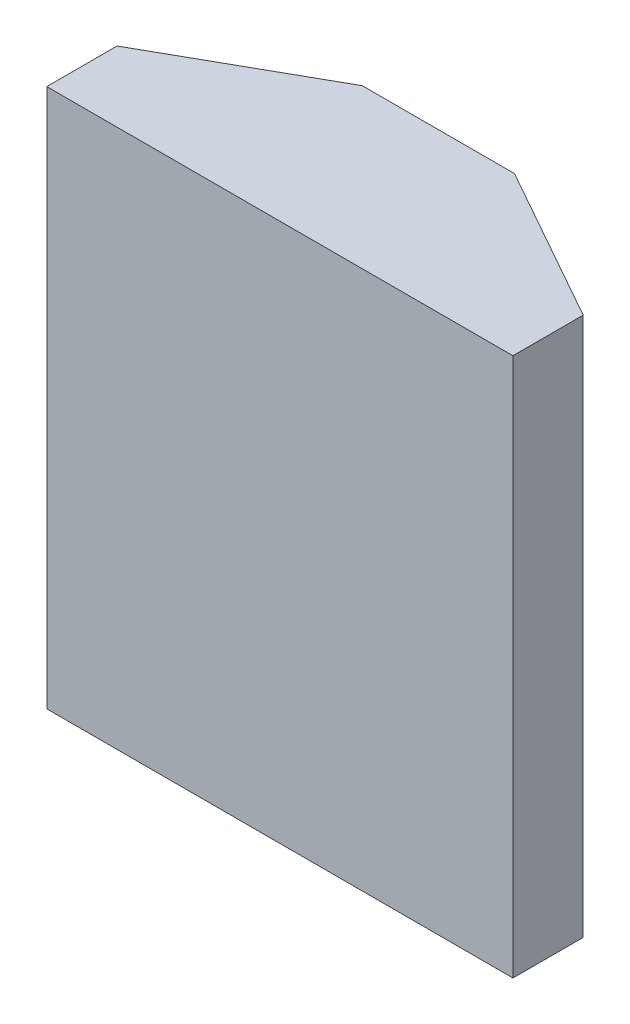
ISO-10303-21;
HEADER;
FILE_DESCRIPTION(('STEP AP214'),'2;1');
FILE_NAME('part.step','',(''),(''),'','','');
FILE_SCHEMA(('AUTOMOTIVE_DESIGN { 1 0 10303 214 1 1 1 1 }'));
ENDSEC;
DATA;
#1=APPLICATION_CONTEXT('core data for automotive mechanical design processes');
#2=APPLICATION_PROTOCOL_DEFINITION('international standard','automotive_design',2000,#1);
#3=PRODUCT_CONTEXT('',#1,'mechanical');
#4=PRODUCT('Part','Part','',(#3));
#5=PRODUCT_RELATED_PRODUCT_CATEGORY('part','',(#4));
#6=PRODUCT_DEFINITION_FORMATION('','',#4);
#7=PRODUCT_DEFINITION_CONTEXT('part definition',#1,'design');
#8=PRODUCT_DEFINITION('design','',#6,#7);
#9=PRODUCT_DEFINITION_SHAPE('','',#8);
#10=(LENGTH_UNIT() NAMED_UNIT(*) SI_UNIT(.MILLI.,.METRE.));
#11=(NAMED_UNIT(*) PLANE_ANGLE_UNIT() SI_UNIT($,.RADIAN.));
#12=(NAMED_UNIT(*) SI_UNIT($,.STERADIAN.) SOLID_ANGLE_UNIT());
#13=UNCERTAINTY_MEASURE_WITH_UNIT(LENGTH_MEASURE(1.E-05),#10,'distance_accuracy_value','');
#14=(GEOMETRIC_REPRESENTATION_CONTEXT(3) GLOBAL_UNCERTAINTY_ASSIGNED_CONTEXT((#13)) GLOBAL_UNIT_ASSIGNED_CONTEXT((#10,
#11,#12)) REPRESENTATION_CONTEXT('',''));
#15=CARTESIAN_POINT('',(0.,0.,0.));
#16=DIRECTION('',(0.,0.,1.));
#17=DIRECTION('',(1.,0.,0.));
#18=AXIS2_PLACEMENT_3D('',#15,#16,#17);
#19=CARTESIAN_POINT('',(18.895,1.,-1.00000000000001));
#20=DIRECTION('',(1.,0.,0.));
#21=DIRECTION('',(0.,0.,-1.));
#22=AXIS2_PLACEMENT_3D('',#19,#20,#21);
#23=PLANE('',#22);
#24=DIRECTION('',(0.,0.,-1.));
#25=VECTOR('',#24,1.);
#26=CARTESIAN_POINT('',(18.895,45.,-1.00000000000001));
#27=LINE('',#26,#25);
#28=CARTESIAN_POINT('',(18.895,45.,-1.00000000000001));
#29=VERTEX_POINT('',#28);
#30=CARTESIAN_POINT('',(18.895,45.,-5.4149740950109));
#31=VERTEX_POINT('',#30);
#32=EDGE_CURVE('E186',#29,#31,#27,.T.);
#33=ORIENTED_EDGE('',*,*,#32,.T.);
#34=DIRECTION('',(0.,1.,0.));
#35=VECTOR('',#34,1.);
#36=CARTESIAN_POINT('',(18.895,1.,-5.4149740950109));
#37=LINE('',#36,#35);
#38=CARTESIAN_POINT('',(18.895,1.,-5.4149740950109));
#39=VERTEX_POINT('',#38);
#40=EDGE_CURVE('E185',#39,#31,#37,.T.);
#41=ORIENTED_EDGE('',*,*,#40,.F.);
#42=DIRECTION('',(0.,0.,-1.));
#43=VECTOR('',#42,1.);
#44=CARTESIAN_POINT('',(18.895,1.,-1.00000000000001));
#45=LINE('',#44,#43);
#46=CARTESIAN_POINT('',(18.895,1.,-1.00000000000001));
#47=VERTEX_POINT('',#46);
#48=EDGE_CURVE('E204',#47,#39,#45,.T.);
#49=ORIENTED_EDGE('',*,*,#48,.F.);
#50=DIRECTION('',(0.,1.,0.));
#51=VECTOR('',#50,1.);
#52=CARTESIAN_POINT('',(18.895,1.,-1.00000000000001));
#53=LINE('',#52,#51);
#54=EDGE_CURVE('E205',#47,#29,#53,.T.);
#55=ORIENTED_EDGE('',*,*,#54,.T.);
#56=EDGE_LOOP('',(#33,#41,#49,#55));
#57=FACE_BOUND('',#56,.T.);
#58=ADVANCED_FACE('F36',(#57),#23,.F.);
#59=CARTESIAN_POINT('',(-18.895,1.,-1.));
#60=DIRECTION('',(0.,0.,1.));
#61=DIRECTION('',(1.,0.,0.));
#62=AXIS2_PLACEMENT_3D('',#59,#60,#61);
#63=PLANE('',#62);
#64=DIRECTION('',(1.,0.,0.));
#65=VECTOR('',#64,1.);
#66=CARTESIAN_POINT('',(-18.895,45.,-1.));
#67=LINE('',#66,#65);
#68=CARTESIAN_POINT('',(-18.895,45.,-1.));
#69=VERTEX_POINT('',#68);
#70=EDGE_CURVE('E201',#69,#29,#67,.T.);
#71=ORIENTED_EDGE('',*,*,#70,.T.);
#72=ORIENTED_EDGE('',*,*,#54,.F.);
#73=DIRECTION('',(1.,0.,0.));
#74=VECTOR('',#73,1.);
#75=CARTESIAN_POINT('',(-18.895,1.,-1.));
#76=LINE('',#75,#74);
#77=CARTESIAN_POINT('',(-18.895,1.,-1.));
#78=VERTEX_POINT('',#77);
#79=EDGE_CURVE('E182',#78,#47,#76,.T.);
#80=ORIENTED_EDGE('',*,*,#79,.F.);
#81=DIRECTION('',(0.,1.,0.));
#82=VECTOR('',#81,1.);
#83=CARTESIAN_POINT('',(-18.895,1.,-1.));
#84=LINE('',#83,#82);
#85=EDGE_CURVE('E208',#78,#69,#84,.T.);
#86=ORIENTED_EDGE('',*,*,#85,.T.);
#87=EDGE_LOOP('',(#71,#72,#80,#86));
#88=FACE_BOUND('',#87,.T.);
#89=ADVANCED_FACE('F295',(#88),#63,.F.);
#90=CARTESIAN_POINT('',(-18.895,1.,-5.41497409501089));
#91=DIRECTION('',(-1.,0.,0.));
#92=DIRECTION('',(0.,0.,1.));
#93=AXIS2_PLACEMENT_3D('',#90,#91,#92);
#94=PLANE('',#93);
#95=DIRECTION('',(0.,0.,1.));
#96=VECTOR('',#95,1.);
#97=CARTESIAN_POINT('',(-18.895,45.,-5.41497409501089));
#98=LINE('',#97,#96);
#99=CARTESIAN_POINT('',(-18.895,45.,-5.41497409501089));
#100=VERTEX_POINT('',#99);
#101=EDGE_CURVE('E198',#100,#69,#98,.T.);
#102=ORIENTED_EDGE('',*,*,#101,.T.);
#103=ORIENTED_EDGE('',*,*,#85,.F.);
#104=DIRECTION('',(0.,0.,1.));
#105=VECTOR('',#104,1.);
#106=CARTESIAN_POINT('',(-18.895,1.,-5.41497409501089));
#107=LINE('',#106,#105);
#108=CARTESIAN_POINT('',(-18.895,1.,-5.41497409501089));
#109=VERTEX_POINT('',#108);
#110=EDGE_CURVE('E175',#109,#78,#107,.T.);
#111=ORIENTED_EDGE('',*,*,#110,.F.);
#112=DIRECTION('',(0.,1.,0.));
#113=VECTOR('',#112,1.);
#114=CARTESIAN_POINT('',(-18.895,1.,-5.41497409501089));
#115=LINE('',#114,#113);
#116=EDGE_CURVE('E210',#109,#100,#115,.T.);
#117=ORIENTED_EDGE('',*,*,#116,.T.);
#118=EDGE_LOOP('',(#102,#103,#111,#117));
#119=FACE_BOUND('',#118,.T.);
#120=ADVANCED_FACE('F301',(#119),#94,.F.);
#121=CARTESIAN_POINT('',(-6.23819096981021,1.,-12.53));
#122=DIRECTION('',(-0.490029494264105,0.,-0.871705853342322));
#123=DIRECTION('',(-0.871705853342322,0.,0.490029494264105));
#124=AXIS2_PLACEMENT_3D('',#121,#122,#123);
#125=PLANE('',#124);
#126=DIRECTION('',(-0.871705853342322,0.,0.490029494264105));
#127=VECTOR('',#126,1.);
#128=CARTESIAN_POINT('',(-6.23819096981021,45.,-12.53));
#129=LINE('',#128,#127);
#130=CARTESIAN_POINT('',(-6.23819096981021,45.,-12.53));
#131=VERTEX_POINT('',#130);
#132=EDGE_CURVE('E195',#131,#100,#129,.T.);
#133=ORIENTED_EDGE('',*,*,#132,.T.);
#134=ORIENTED_EDGE('',*,*,#116,.F.);
#135=DIRECTION('',(-0.871705853342322,0.,0.490029494264105));
#136=VECTOR('',#135,1.);
#137=CARTESIAN_POINT('',(-6.23819096981021,1.,-12.53));
#138=LINE('',#137,#136);
#139=CARTESIAN_POINT('',(-6.23819096981021,1.,-12.53));
#140=VERTEX_POINT('',#139);
#141=EDGE_CURVE('E171',#140,#109,#138,.T.);
#142=ORIENTED_EDGE('',*,*,#141,.F.);
#143=DIRECTION('',(0.,1.,0.));
#144=VECTOR('',#143,1.);
#145=CARTESIAN_POINT('',(-6.23819096981021,1.,-12.53));
#146=LINE('',#145,#144);
#147=EDGE_CURVE('E212',#140,#131,#146,.T.);
#148=ORIENTED_EDGE('',*,*,#147,.T.);
#149=EDGE_LOOP('',(#133,#134,#142,#148));
#150=FACE_BOUND('',#149,.T.);
#151=ADVANCED_FACE('F339',(#150),#125,.F.);
#152=CARTESIAN_POINT('',(6.23819096981021,1.,-12.53));
#153=DIRECTION('',(0.,0.,-1.));
#154=DIRECTION('',(-1.,0.,0.));
#155=AXIS2_PLACEMENT_3D('',#152,#153,#154);
#156=PLANE('',#155);
#157=DIRECTION('',(-1.,0.,0.));
#158=VECTOR('',#157,1.);
#159=CARTESIAN_POINT('',(6.23819096981021,45.,-12.53));
#160=LINE('',#159,#158);
#161=CARTESIAN_POINT('',(6.23819096981021,45.,-12.53));
#162=VERTEX_POINT('',#161);
#163=EDGE_CURVE('E193',#162,#131,#160,.T.);
#164=ORIENTED_EDGE('',*,*,#163,.T.);
#165=ORIENTED_EDGE('',*,*,#147,.F.);
#166=DIRECTION('',(-1.,0.,0.));
#167=VECTOR('',#166,1.);
#168=CARTESIAN_POINT('',(6.23819096981021,1.,-12.53));
#169=LINE('',#168,#167);
#170=CARTESIAN_POINT('',(-2.89,1.,-12.53));
#171=VERTEX_POINT('',#170);
#172=EDGE_CURVE('E172',#171,#140,#169,.T.);
#173=ORIENTED_EDGE('',*,*,#172,.F.);
#174=DIRECTION('',(0.,-1.,0.));
#175=VECTOR('',#174,1.);
#176=CARTESIAN_POINT('',(-2.89,46.001,-12.53));
#177=LINE('',#176,#175);
#178=CARTESIAN_POINT('',(-2.89,0.,-12.53));
#179=VERTEX_POINT('',#178);
#180=EDGE_CURVE('E321',#171,#179,#177,.T.);
#181=ORIENTED_EDGE('',*,*,#180,.T.);
#182=DIRECTION('',(1.,0.,0.));
#183=VECTOR('',#182,1.);
#184=CARTESIAN_POINT('',(-2.89,0.,-12.53));
#185=LINE('',#184,#183);
#186=CARTESIAN_POINT('',(2.89,0.,-12.53));
#187=VERTEX_POINT('',#186);
#188=EDGE_CURVE('E164',#179,#187,#185,.T.);
#189=ORIENTED_EDGE('',*,*,#188,.T.);
#190=DIRECTION('',(0.,-1.,0.));
#191=VECTOR('',#190,1.);
#192=CARTESIAN_POINT('',(2.89,46.001,-12.53));
#193=LINE('',#192,#191);
#194=CARTESIAN_POINT('',(2.89,1.,-12.53));
#195=VERTEX_POINT('',#194);
#196=EDGE_CURVE('E150',#195,#187,#193,.T.);
#197=ORIENTED_EDGE('',*,*,#196,.F.);
#198=CARTESIAN_POINT('',(6.23819096981021,1.,-12.53));
#199=VERTEX_POINT('',#198);
#200=EDGE_CURVE('E161',#199,#195,#169,.T.);
#201=ORIENTED_EDGE('',*,*,#200,.F.);
#202=DIRECTION('',(0.,1.,0.));
#203=VECTOR('',#202,1.);
#204=CARTESIAN_POINT('',(6.23819096981021,1.,-12.53));
#205=LINE('',#204,#203);
#206=EDGE_CURVE('E214',#199,#162,#205,.T.);
#207=ORIENTED_EDGE('',*,*,#206,.T.);
#208=EDGE_LOOP('',(#164,#165,#173,#181,#189,#197,#201,#207));
#209=FACE_BOUND('',#208,.T.);
#210=ADVANCED_FACE('F160',(#209),#156,.F.);
#211=CARTESIAN_POINT('',(18.895,1.,-5.4149740950109));
#212=DIRECTION('',(0.490029494264104,0.,-0.871705853342322));
#213=DIRECTION('',(-0.871705853342322,0.,-0.490029494264104));
#214=AXIS2_PLACEMENT_3D('',#211,#212,#213);
#215=PLANE('',#214);
#216=DIRECTION('',(-0.871705853342323,0.,-0.490029494264104));
#217=VECTOR('',#216,1.);
#218=CARTESIAN_POINT('',(18.895,45.,-5.4149740950109));
#219=LINE('',#218,#217);
#220=EDGE_CURVE('E189',#31,#162,#219,.T.);
#221=ORIENTED_EDGE('',*,*,#220,.T.);
#222=ORIENTED_EDGE('',*,*,#206,.F.);
#223=DIRECTION('',(-0.871705853342323,0.,-0.490029494264104));
#224=VECTOR('',#223,1.);
#225=CARTESIAN_POINT('',(18.895,1.,-5.4149740950109));
#226=LINE('',#225,#224);
#227=EDGE_CURVE('E170',#39,#199,#226,.T.);
#228=ORIENTED_EDGE('',*,*,#227,.F.);
#229=ORIENTED_EDGE('',*,*,#40,.T.);
#230=EDGE_LOOP('',(#221,#222,#228,#229));
#231=FACE_BOUND('',#230,.T.);
#232=ADVANCED_FACE('F305',(#231),#215,.F.);
#233=CARTESIAN_POINT('',(0.,1.,0.));
#234=DIRECTION('',(0.,1.,0.));
#235=DIRECTION('',(0.,0.,1.));
#236=AXIS2_PLACEMENT_3D('',#233,#234,#235);
#237=PLANE('',#236);
#238=DIRECTION('',(-1.,0.,0.));
#239=VECTOR('',#238,1.);
#240=CARTESIAN_POINT('',(-2.89,1.,-9.97));
#241=LINE('',#240,#239);
#242=CARTESIAN_POINT('',(2.89,1.,-9.97));
#243=VERTEX_POINT('',#242);
#244=CARTESIAN_POINT('',(-2.89,1.,-9.97));
#245=VERTEX_POINT('',#244);
#246=EDGE_CURVE('E322',#243,#245,#241,.T.);
#247=ORIENTED_EDGE('',*,*,#246,.T.);
#248=CARTESIAN_POINT('',(-2.89,1.,-11.25));
#249=DIRECTION('',(0.,1.,0.));
#250=DIRECTION('',(0.,0.,1.));
#251=AXIS2_PLACEMENT_3D('',#248,#249,#250);
#252=CIRCLE('',#251,1.28);
#253=EDGE_CURVE('E318',#245,#171,#252,.F.);
#254=ORIENTED_EDGE('',*,*,#253,.T.);
#255=ORIENTED_EDGE('',*,*,#172,.T.);
#256=ORIENTED_EDGE('',*,*,#141,.T.);
#257=ORIENTED_EDGE('',*,*,#110,.T.);
#258=ORIENTED_EDGE('',*,*,#79,.T.);
#259=ORIENTED_EDGE('',*,*,#48,.T.);
#260=ORIENTED_EDGE('',*,*,#227,.T.);
#261=ORIENTED_EDGE('',*,*,#200,.T.);
#262=CARTESIAN_POINT('',(2.89,1.,-11.25));
#263=DIRECTION('',(0.,1.,0.));
#264=DIRECTION('',(0.,0.,1.));
#265=AXIS2_PLACEMENT_3D('',#262,#263,#264);
#266=CIRCLE('',#265,1.28);
#267=EDGE_CURVE('E147',#195,#243,#266,.F.);
#268=ORIENTED_EDGE('',*,*,#267,.T.);
#269=EDGE_LOOP('',(#247,#254,#255,#256,#257,#258,#259,#260,#261,#268));
#270=FACE_BOUND('',#269,.T.);
#271=ADVANCED_FACE('F167',(#270),#237,.T.);
#272=CARTESIAN_POINT('',(0.,45.,0.));
#273=DIRECTION('',(0.,1.,0.));
#274=DIRECTION('',(0.,0.,1.));
#275=AXIS2_PLACEMENT_3D('',#272,#273,#274);
#276=PLANE('',#275);
#277=ORIENTED_EDGE('',*,*,#32,.F.);
#278=ORIENTED_EDGE('',*,*,#70,.F.);
#279=ORIENTED_EDGE('',*,*,#101,.F.);
#280=ORIENTED_EDGE('',*,*,#132,.F.);
#281=ORIENTED_EDGE('',*,*,#163,.F.);
#282=ORIENTED_EDGE('',*,*,#220,.F.);
#283=EDGE_LOOP('',(#277,#278,#279,#280,#281,#282));
#284=FACE_BOUND('',#283,.T.);
#285=ADVANCED_FACE('F335',(#284),#276,.F.);
#286=CARTESIAN_POINT('',(-2.89,46.001,-11.25));
#287=DIRECTION('',(0.,-1.,0.));
#288=DIRECTION('',(0.,0.,-1.));
#289=AXIS2_PLACEMENT_3D('',#286,#287,#288);
#290=CYLINDRICAL_SURFACE('',#289,1.28);
#291=DIRECTION('',(0.,-1.,0.));
#292=VECTOR('',#291,1.);
#293=CARTESIAN_POINT('',(-2.89,46.001,-9.97));
#294=LINE('',#293,#292);
#295=CARTESIAN_POINT('',(-2.89,0.,-9.97));
#296=VERTEX_POINT('',#295);
#297=EDGE_CURVE('E155',#245,#296,#294,.T.);
#298=ORIENTED_EDGE('',*,*,#297,.T.);
#299=CARTESIAN_POINT('',(-2.89,0.,-11.25));
#300=DIRECTION('',(0.,-1.,0.));
#301=DIRECTION('',(0.,0.,-1.));
#302=AXIS2_PLACEMENT_3D('',#299,#300,#301);
#303=CIRCLE('',#302,1.28);
#304=EDGE_CURVE('E59',#296,#179,#303,.T.);
#305=ORIENTED_EDGE('',*,*,#304,.T.);
#306=ORIENTED_EDGE('',*,*,#180,.F.);
#307=ORIENTED_EDGE('',*,*,#253,.F.);
#308=EDGE_LOOP('',(#298,#305,#306,#307));
#309=FACE_BOUND('',#308,.T.);
#310=ADVANCED_FACE('F344',(#309),#290,.F.);
#311=CARTESIAN_POINT('',(-2.89,46.001,-9.97));
#312=DIRECTION('',(0.,0.,1.));
#313=DIRECTION('',(1.,0.,0.));
#314=AXIS2_PLACEMENT_3D('',#311,#312,#313);
#315=PLANE('',#314);
#316=DIRECTION('',(0.,-1.,0.));
#317=VECTOR('',#316,1.);
#318=CARTESIAN_POINT('',(2.89,46.001,-9.97));
#319=LINE('',#318,#317);
#320=CARTESIAN_POINT('',(2.89,0.,-9.97));
#321=VERTEX_POINT('',#320);
#322=EDGE_CURVE('E51',#243,#321,#319,.T.);
#323=ORIENTED_EDGE('',*,*,#322,.T.);
#324=DIRECTION('',(-1.,0.,0.));
#325=VECTOR('',#324,1.);
#326=CARTESIAN_POINT('',(-2.89,0.,-9.97));
#327=LINE('',#326,#325);
#328=EDGE_CURVE('E190',#321,#296,#327,.T.);
#329=ORIENTED_EDGE('',*,*,#328,.T.);
#330=ORIENTED_EDGE('',*,*,#297,.F.);
#331=ORIENTED_EDGE('',*,*,#246,.F.);
#332=EDGE_LOOP('',(#323,#329,#330,#331));
#333=FACE_BOUND('',#332,.T.);
#334=ADVANCED_FACE('F347',(#333),#315,.F.);
#335=CARTESIAN_POINT('',(2.89,46.001,-11.25));
#336=DIRECTION('',(0.,-1.,0.));
#337=DIRECTION('',(0.,0.,-1.));
#338=AXIS2_PLACEMENT_3D('',#335,#336,#337);
#339=CYLINDRICAL_SURFACE('',#338,1.28);
#340=ORIENTED_EDGE('',*,*,#196,.T.);
#341=CARTESIAN_POINT('',(2.89,0.,-11.25));
#342=DIRECTION('',(0.,-1.,0.));
#343=DIRECTION('',(0.,0.,-1.));
#344=AXIS2_PLACEMENT_3D('',#341,#342,#343);
#345=CIRCLE('',#344,1.28);
#346=EDGE_CURVE('E312',#187,#321,#345,.T.);
#347=ORIENTED_EDGE('',*,*,#346,.T.);
#348=ORIENTED_EDGE('',*,*,#322,.F.);
#349=ORIENTED_EDGE('',*,*,#267,.F.);
#350=EDGE_LOOP('',(#340,#347,#348,#349));
#351=FACE_BOUND('',#350,.T.);
#352=ADVANCED_FACE('F149',(#351),#339,.F.);
#353=CARTESIAN_POINT('',(19.895,46.,0.));
#354=DIRECTION('',(-1.,0.,0.));
#355=DIRECTION('',(0.,0.,1.));
#356=AXIS2_PLACEMENT_3D('',#353,#354,#355);
#357=PLANE('',#356);
#358=DIRECTION('',(0.,0.,-1.));
#359=VECTOR('',#358,1.);
#360=CARTESIAN_POINT('',(19.895,0.,0.));
#361=LINE('',#360,#359);
#362=CARTESIAN_POINT('',(19.895,0.,0.));
#363=VERTEX_POINT('',#362);
#364=CARTESIAN_POINT('',(19.895,0.,-6.00000000000001));
#365=VERTEX_POINT('',#364);
#366=EDGE_CURVE('E207',#363,#365,#361,.T.);
#367=ORIENTED_EDGE('',*,*,#366,.T.);
#368=DIRECTION('',(0.,-1.,0.));
#369=VECTOR('',#368,1.);
#370=CARTESIAN_POINT('',(19.895,46.,-6.00000000000001));
#371=LINE('',#370,#369);
#372=CARTESIAN_POINT('',(19.895,46.,-6.00000000000001));
#373=VERTEX_POINT('',#372);
#374=EDGE_CURVE('E11',#373,#365,#371,.T.);
#375=ORIENTED_EDGE('',*,*,#374,.F.);
#376=DIRECTION('',(0.,0.,-1.));
#377=VECTOR('',#376,1.);
#378=CARTESIAN_POINT('',(19.895,46.,0.));
#379=LINE('',#378,#377);
#380=CARTESIAN_POINT('',(19.895,46.,0.));
#381=VERTEX_POINT('',#380);
#382=EDGE_CURVE('E217',#381,#373,#379,.T.);
#383=ORIENTED_EDGE('',*,*,#382,.F.);
#384=DIRECTION('',(0.,-1.,0.));
#385=VECTOR('',#384,1.);
#386=CARTESIAN_POINT('',(19.895,46.,0.));
#387=LINE('',#386,#385);
#388=EDGE_CURVE('E231',#381,#363,#387,.T.);
#389=ORIENTED_EDGE('',*,*,#388,.T.);
#390=EDGE_LOOP('',(#367,#375,#383,#389));
#391=FACE_BOUND('',#390,.T.);
#392=ADVANCED_FACE('F38',(#391),#357,.F.);
#393=CARTESIAN_POINT('',(19.895,46.,-6.00000000000001));
#394=DIRECTION('',(-0.490029494264104,0.,0.871705853342322));
#395=DIRECTION('',(0.871705853342322,0.,0.490029494264104));
#396=AXIS2_PLACEMENT_3D('',#393,#394,#395);
#397=PLANE('',#396);
#398=DIRECTION('',(-0.871705853342322,0.,-0.490029494264104));
#399=VECTOR('',#398,1.);
#400=CARTESIAN_POINT('',(19.895,0.,-6.00000000000001));
#401=LINE('',#400,#399);
#402=CARTESIAN_POINT('',(6.5,0.,-13.53));
#403=VERTEX_POINT('',#402);
#404=EDGE_CURVE('E234',#365,#403,#401,.T.);
#405=ORIENTED_EDGE('',*,*,#404,.T.);
#406=DIRECTION('',(0.,-1.,0.));
#407=VECTOR('',#406,1.);
#408=CARTESIAN_POINT('',(6.5,46.,-13.53));
#409=LINE('',#408,#407);
#410=CARTESIAN_POINT('',(6.5,46.,-13.53));
#411=VERTEX_POINT('',#410);
#412=EDGE_CURVE('E44',#411,#403,#409,.T.);
#413=ORIENTED_EDGE('',*,*,#412,.F.);
#414=DIRECTION('',(-0.871705853342322,0.,-0.490029494264104));
#415=VECTOR('',#414,1.);
#416=CARTESIAN_POINT('',(19.895,46.,-6.00000000000001));
#417=LINE('',#416,#415);
#418=EDGE_CURVE('E220',#373,#411,#417,.T.);
#419=ORIENTED_EDGE('',*,*,#418,.F.);
#420=ORIENTED_EDGE('',*,*,#374,.T.);
#421=EDGE_LOOP('',(#405,#413,#419,#420));
#422=FACE_BOUND('',#421,.T.);
#423=ADVANCED_FACE('F281',(#422),#397,.F.);
#424=CARTESIAN_POINT('',(6.5,46.,-13.53));
#425=DIRECTION('',(0.,0.,1.));
#426=DIRECTION('',(1.,0.,0.));
#427=AXIS2_PLACEMENT_3D('',#424,#425,#426);
#428=PLANE('',#427);
#429=DIRECTION('',(-1.,0.,0.));
#430=VECTOR('',#429,1.);
#431=CARTESIAN_POINT('',(6.5,0.,-13.53));
#432=LINE('',#431,#430);
#433=CARTESIAN_POINT('',(-6.5,0.,-13.53));
#434=VERTEX_POINT('',#433);
#435=EDGE_CURVE('E236',#403,#434,#432,.T.);
#436=ORIENTED_EDGE('',*,*,#435,.T.);
#437=DIRECTION('',(0.,-1.,0.));
#438=VECTOR('',#437,1.);
#439=CARTESIAN_POINT('',(-6.5,46.,-13.53));
#440=LINE('',#439,#438);
#441=CARTESIAN_POINT('',(-6.5,46.,-13.53));
#442=VERTEX_POINT('',#441);
#443=EDGE_CURVE('E251',#442,#434,#440,.T.);
#444=ORIENTED_EDGE('',*,*,#443,.F.);
#445=DIRECTION('',(-1.,0.,0.));
#446=VECTOR('',#445,1.);
#447=CARTESIAN_POINT('',(6.5,46.,-13.53));
#448=LINE('',#447,#446);
#449=EDGE_CURVE('E223',#411,#442,#448,.T.);
#450=ORIENTED_EDGE('',*,*,#449,.F.);
#451=ORIENTED_EDGE('',*,*,#412,.T.);
#452=EDGE_LOOP('',(#436,#444,#450,#451));
#453=FACE_BOUND('',#452,.T.);
#454=ADVANCED_FACE('F258',(#453),#428,.F.);
#455=CARTESIAN_POINT('',(-6.5,46.,-13.53));
#456=DIRECTION('',(0.490029494264105,0.,0.871705853342322));
#457=DIRECTION('',(0.871705853342322,0.,-0.490029494264105));
#458=AXIS2_PLACEMENT_3D('',#455,#456,#457);
#459=PLANE('',#458);
#460=DIRECTION('',(-0.871705853342322,0.,0.490029494264104));
#461=VECTOR('',#460,1.);
#462=CARTESIAN_POINT('',(-6.5,0.,-13.53));
#463=LINE('',#462,#461);
#464=CARTESIAN_POINT('',(-19.895,0.,-6.));
#465=VERTEX_POINT('',#464);
#466=EDGE_CURVE('E238',#434,#465,#463,.T.);
#467=ORIENTED_EDGE('',*,*,#466,.T.);
#468=DIRECTION('',(0.,-1.,0.));
#469=VECTOR('',#468,1.);
#470=CARTESIAN_POINT('',(-19.895,46.,-6.));
#471=LINE('',#470,#469);
#472=CARTESIAN_POINT('',(-19.895,46.,-6.));
#473=VERTEX_POINT('',#472);
#474=EDGE_CURVE('E248',#473,#465,#471,.T.);
#475=ORIENTED_EDGE('',*,*,#474,.F.);
#476=DIRECTION('',(-0.871705853342322,0.,0.490029494264104));
#477=VECTOR('',#476,1.);
#478=CARTESIAN_POINT('',(-6.5,46.,-13.53));
#479=LINE('',#478,#477);
#480=EDGE_CURVE('E225',#442,#473,#479,.T.);
#481=ORIENTED_EDGE('',*,*,#480,.F.);
#482=ORIENTED_EDGE('',*,*,#443,.T.);
#483=EDGE_LOOP('',(#467,#475,#481,#482));
#484=FACE_BOUND('',#483,.T.);
#485=ADVANCED_FACE('F269',(#484),#459,.F.);
#486=CARTESIAN_POINT('',(-19.895,46.,-6.));
#487=DIRECTION('',(1.,0.,0.));
#488=DIRECTION('',(0.,0.,-1.));
#489=AXIS2_PLACEMENT_3D('',#486,#487,#488);
#490=PLANE('',#489);
#491=DIRECTION('',(0.,0.,1.));
#492=VECTOR('',#491,1.);
#493=CARTESIAN_POINT('',(-19.895,0.,-6.));
#494=LINE('',#493,#492);
#495=CARTESIAN_POINT('',(-19.895,0.,0.));
#496=VERTEX_POINT('',#495);
#497=EDGE_CURVE('E240',#465,#496,#494,.T.);
#498=ORIENTED_EDGE('',*,*,#497,.T.);
#499=DIRECTION('',(0.,-1.,0.));
#500=VECTOR('',#499,1.);
#501=CARTESIAN_POINT('',(-19.895,46.,0.));
#502=LINE('',#501,#500);
#503=CARTESIAN_POINT('',(-19.895,46.,0.));
#504=VERTEX_POINT('',#503);
#505=EDGE_CURVE('E245',#504,#496,#502,.T.);
#506=ORIENTED_EDGE('',*,*,#505,.F.);
#507=DIRECTION('',(0.,0.,1.));
#508=VECTOR('',#507,1.);
#509=CARTESIAN_POINT('',(-19.895,46.,-6.));
#510=LINE('',#509,#508);
#511=EDGE_CURVE('E227',#473,#504,#510,.T.);
#512=ORIENTED_EDGE('',*,*,#511,.F.);
#513=ORIENTED_EDGE('',*,*,#474,.T.);
#514=EDGE_LOOP('',(#498,#506,#512,#513));
#515=FACE_BOUND('',#514,.T.);
#516=ADVANCED_FACE('F273',(#515),#490,.F.);
#517=CARTESIAN_POINT('',(-19.895,46.,0.));
#518=DIRECTION('',(0.,0.,-1.));
#519=DIRECTION('',(-1.,0.,0.));
#520=AXIS2_PLACEMENT_3D('',#517,#518,#519);
#521=PLANE('',#520);
#522=DIRECTION('',(1.,0.,0.));
#523=VECTOR('',#522,1.);
#524=CARTESIAN_POINT('',(-19.895,0.,0.));
#525=LINE('',#524,#523);
#526=EDGE_CURVE('E221',#496,#363,#525,.T.);
#527=ORIENTED_EDGE('',*,*,#526,.T.);
#528=ORIENTED_EDGE('',*,*,#388,.F.);
#529=DIRECTION('',(1.,0.,0.));
#530=VECTOR('',#529,1.);
#531=CARTESIAN_POINT('',(-19.895,46.,0.));
#532=LINE('',#531,#530);
#533=EDGE_CURVE('E229',#504,#381,#532,.T.);
#534=ORIENTED_EDGE('',*,*,#533,.F.);
#535=ORIENTED_EDGE('',*,*,#505,.T.);
#536=EDGE_LOOP('',(#527,#528,#534,#535));
#537=FACE_BOUND('',#536,.T.);
#538=ADVANCED_FACE('F284',(#537),#521,.F.);
#539=CARTESIAN_POINT('',(0.,46.,0.));
#540=DIRECTION('',(0.,1.,0.));
#541=DIRECTION('',(0.,0.,1.));
#542=AXIS2_PLACEMENT_3D('',#539,#540,#541);
#543=PLANE('',#542);
#544=ORIENTED_EDGE('',*,*,#382,.T.);
#545=ORIENTED_EDGE('',*,*,#418,.T.);
#546=ORIENTED_EDGE('',*,*,#449,.T.);
#547=ORIENTED_EDGE('',*,*,#480,.T.);
#548=ORIENTED_EDGE('',*,*,#511,.T.);
#549=ORIENTED_EDGE('',*,*,#533,.T.);
#550=EDGE_LOOP('',(#544,#545,#546,#547,#548,#549));
#551=FACE_BOUND('',#550,.T.);
#552=ADVANCED_FACE('F277',(#551),#543,.T.);
#553=CARTESIAN_POINT('',(0.,0.,0.));
#554=DIRECTION('',(0.,1.,0.));
#555=DIRECTION('',(0.,0.,1.));
#556=AXIS2_PLACEMENT_3D('',#553,#554,#555);
#557=PLANE('',#556);
#558=ORIENTED_EDGE('',*,*,#188,.F.);
#559=ORIENTED_EDGE('',*,*,#304,.F.);
#560=ORIENTED_EDGE('',*,*,#328,.F.);
#561=ORIENTED_EDGE('',*,*,#346,.F.);
#562=EDGE_LOOP('',(#558,#559,#560,#561));
#563=FACE_BOUND('',#562,.T.);
#564=ORIENTED_EDGE('',*,*,#366,.F.);
#565=ORIENTED_EDGE('',*,*,#526,.F.);
#566=ORIENTED_EDGE('',*,*,#497,.F.);
#567=ORIENTED_EDGE('',*,*,#466,.F.);
#568=ORIENTED_EDGE('',*,*,#435,.F.);
#569=ORIENTED_EDGE('',*,*,#404,.F.);
#570=EDGE_LOOP('',(#564,#565,#566,#567,#568,#569));
#571=FACE_BOUND('',#570,.T.);
#572=ADVANCED_FACE('F264',(#563,#571),#557,.F.);
#573=CLOSED_SHELL('',(#58,#89,#120,#151,#210,#232,#271,#285,#310,#334,#352,#392,#423,#454,#485,
#516,#538,#552,#572));
#574=MANIFOLD_SOLID_BREP('B2',#573);
#575=ADVANCED_BREP_SHAPE_REPRESENTATION('',(#18,#574),#14);
#576=SHAPE_DEFINITION_REPRESENTATION(#9,#575);
ENDSEC;
END-ISO-10303-21;
